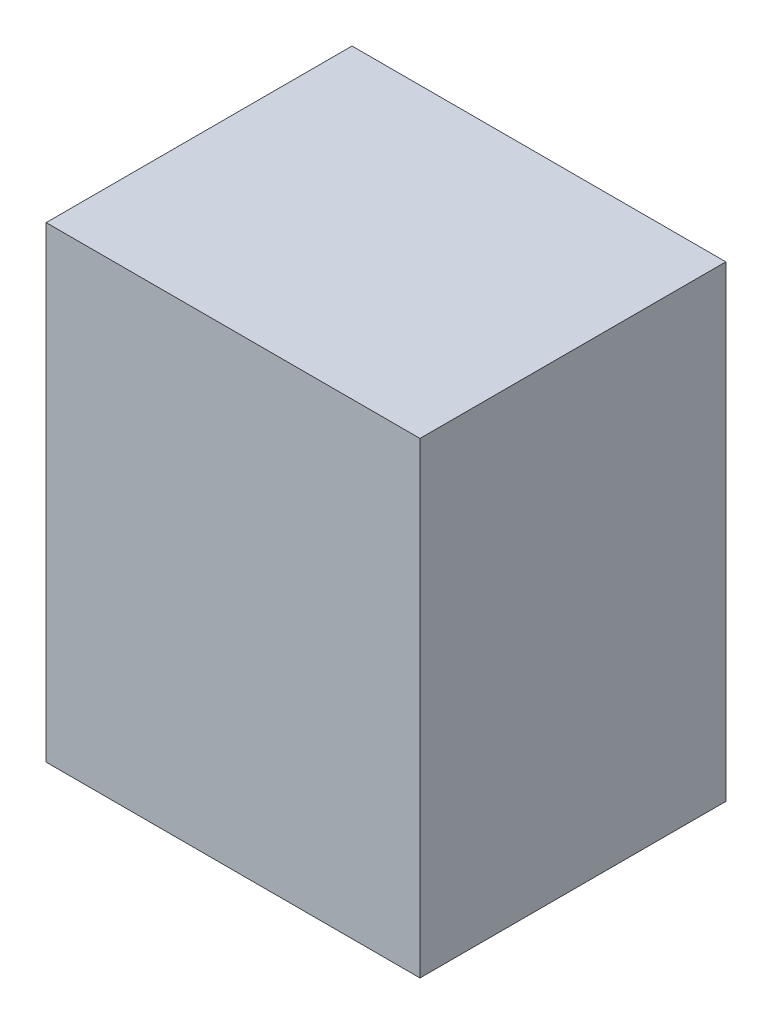
ISO-10303-21;
HEADER;
FILE_DESCRIPTION(('STEP AP214'),'2;1');
FILE_NAME('part.step','',(''),(''),'','','');
FILE_SCHEMA(('AUTOMOTIVE_DESIGN { 1 0 10303 214 1 1 1 1 }'));
ENDSEC;
DATA;
#1=APPLICATION_CONTEXT('core data for automotive mechanical design processes');
#2=APPLICATION_PROTOCOL_DEFINITION('international standard','automotive_design',2000,#1);
#3=PRODUCT_CONTEXT('',#1,'mechanical');
#4=PRODUCT('Part','Part','',(#3));
#5=PRODUCT_RELATED_PRODUCT_CATEGORY('part','',(#4));
#6=PRODUCT_DEFINITION_FORMATION('','',#4);
#7=PRODUCT_DEFINITION_CONTEXT('part definition',#1,'design');
#8=PRODUCT_DEFINITION('design','',#6,#7);
#9=PRODUCT_DEFINITION_SHAPE('','',#8);
#10=(LENGTH_UNIT() NAMED_UNIT(*) SI_UNIT(.MILLI.,.METRE.));
#11=(NAMED_UNIT(*) PLANE_ANGLE_UNIT() SI_UNIT($,.RADIAN.));
#12=(NAMED_UNIT(*) SI_UNIT($,.STERADIAN.) SOLID_ANGLE_UNIT());
#13=UNCERTAINTY_MEASURE_WITH_UNIT(LENGTH_MEASURE(1.E-05),#10,'distance_accuracy_value','');
#14=(GEOMETRIC_REPRESENTATION_CONTEXT(3) GLOBAL_UNCERTAINTY_ASSIGNED_CONTEXT((#13)) GLOBAL_UNIT_ASSIGNED_CONTEXT((#10,
#11,#12)) REPRESENTATION_CONTEXT('',''));
#15=CARTESIAN_POINT('',(0.,0.,0.));
#16=DIRECTION('',(0.,0.,1.));
#17=DIRECTION('',(1.,0.,0.));
#18=AXIS2_PLACEMENT_3D('',#15,#16,#17);
#19=CARTESIAN_POINT('',(-0.855,3.675,0.35));
#20=DIRECTION('',(0.,0.,-1.));
#21=DIRECTION('',(-1.,0.,0.));
#22=AXIS2_PLACEMENT_3D('',#19,#20,#21);
#23=PLANE('',#22);
#24=DIRECTION('',(0.,1.,0.));
#25=VECTOR('',#24,1.);
#26=CARTESIAN_POINT('',(-0.415,3.125,0.35));
#27=LINE('',#26,#25);
#28=CARTESIAN_POINT('',(-0.415,3.125,0.35));
#29=VERTEX_POINT('',#28);
#30=CARTESIAN_POINT('',(-0.415,3.675,0.35));
#31=VERTEX_POINT('',#30);
#32=EDGE_CURVE('E19',#29,#31,#27,.T.);
#33=ORIENTED_EDGE('',*,*,#32,.T.);
#34=DIRECTION('',(1.,0.,0.));
#35=VECTOR('',#34,1.);
#36=CARTESIAN_POINT('',(-0.855,3.675,0.35));
#37=LINE('',#36,#35);
#38=CARTESIAN_POINT('',(-0.855,3.675,0.35));
#39=VERTEX_POINT('',#38);
#40=EDGE_CURVE('E80',#31,#39,#37,.F.);
#41=ORIENTED_EDGE('',*,*,#40,.T.);
#42=DIRECTION('',(0.,1.,0.));
#43=VECTOR('',#42,1.);
#44=CARTESIAN_POINT('',(-0.855,3.125,0.35));
#45=LINE('',#44,#43);
#46=CARTESIAN_POINT('',(-0.855,3.125,0.35));
#47=VERTEX_POINT('',#46);
#48=EDGE_CURVE('E67',#39,#47,#45,.F.);
#49=ORIENTED_EDGE('',*,*,#48,.T.);
#50=DIRECTION('',(1.,0.,0.));
#51=VECTOR('',#50,1.);
#52=CARTESIAN_POINT('',(-0.855,3.125,0.35));
#53=LINE('',#52,#51);
#54=EDGE_CURVE('E54',#47,#29,#53,.T.);
#55=ORIENTED_EDGE('',*,*,#54,.T.);
#56=EDGE_LOOP('',(#33,#41,#49,#55));
#57=FACE_BOUND('',#56,.T.);
#58=ADVANCED_FACE('F16',(#57),#23,.F.);
#59=CARTESIAN_POINT('',(-0.415,3.125,-0.01));
#60=DIRECTION('',(-1.,0.,0.));
#61=DIRECTION('',(0.,0.,1.));
#62=AXIS2_PLACEMENT_3D('',#59,#60,#61);
#63=PLANE('',#62);
#64=DIRECTION('',(0.,0.,1.));
#65=VECTOR('',#64,1.);
#66=CARTESIAN_POINT('',(-0.415,3.125,-0.01));
#67=LINE('',#66,#65);
#68=CARTESIAN_POINT('',(-0.415,3.125,-0.01));
#69=VERTEX_POINT('',#68);
#70=EDGE_CURVE('E60',#29,#69,#67,.F.);
#71=ORIENTED_EDGE('',*,*,#70,.T.);
#72=DIRECTION('',(0.,1.,0.));
#73=VECTOR('',#72,1.);
#74=CARTESIAN_POINT('',(-0.415,3.675,-0.01));
#75=LINE('',#74,#73);
#76=CARTESIAN_POINT('',(-0.415,3.675,-0.01));
#77=VERTEX_POINT('',#76);
#78=EDGE_CURVE('E82',#77,#69,#75,.F.);
#79=ORIENTED_EDGE('',*,*,#78,.F.);
#80=DIRECTION('',(0.,0.,-1.));
#81=VECTOR('',#80,1.);
#82=CARTESIAN_POINT('',(-0.415,3.675,-0.01));
#83=LINE('',#82,#81);
#84=EDGE_CURVE('E63',#77,#31,#83,.F.);
#85=ORIENTED_EDGE('',*,*,#84,.T.);
#86=ORIENTED_EDGE('',*,*,#32,.F.);
#87=EDGE_LOOP('',(#71,#79,#85,#86));
#88=FACE_BOUND('',#87,.T.);
#89=ADVANCED_FACE('F59',(#88),#63,.F.);
#90=CARTESIAN_POINT('',(-0.855,3.125,-0.01));
#91=DIRECTION('',(0.,1.,0.));
#92=DIRECTION('',(0.,0.,1.));
#93=AXIS2_PLACEMENT_3D('',#90,#91,#92);
#94=PLANE('',#93);
#95=DIRECTION('',(0.,0.,-1.));
#96=VECTOR('',#95,1.);
#97=CARTESIAN_POINT('',(-0.855,3.125,-0.01));
#98=LINE('',#97,#96);
#99=CARTESIAN_POINT('',(-0.855,3.125,-0.01));
#100=VERTEX_POINT('',#99);
#101=EDGE_CURVE('E69',#47,#100,#98,.T.);
#102=ORIENTED_EDGE('',*,*,#101,.T.);
#103=DIRECTION('',(-1.,0.,0.));
#104=VECTOR('',#103,1.);
#105=CARTESIAN_POINT('',(-0.855,3.125,-0.01));
#106=LINE('',#105,#104);
#107=EDGE_CURVE('E73',#69,#100,#106,.T.);
#108=ORIENTED_EDGE('',*,*,#107,.F.);
#109=ORIENTED_EDGE('',*,*,#70,.F.);
#110=ORIENTED_EDGE('',*,*,#54,.F.);
#111=EDGE_LOOP('',(#102,#108,#109,#110));
#112=FACE_BOUND('',#111,.T.);
#113=ADVANCED_FACE('F71',(#112),#94,.F.);
#114=CARTESIAN_POINT('',(-0.855,3.125,-0.01));
#115=DIRECTION('',(1.,0.,0.));
#116=DIRECTION('',(0.,0.,-1.));
#117=AXIS2_PLACEMENT_3D('',#114,#115,#116);
#118=PLANE('',#117);
#119=DIRECTION('',(0.,0.,-1.));
#120=VECTOR('',#119,1.);
#121=CARTESIAN_POINT('',(-0.855,3.675,-0.01));
#122=LINE('',#121,#120);
#123=CARTESIAN_POINT('',(-0.855,3.675,-0.01));
#124=VERTEX_POINT('',#123);
#125=EDGE_CURVE('E34',#39,#124,#122,.T.);
#126=ORIENTED_EDGE('',*,*,#125,.T.);
#127=DIRECTION('',(0.,1.,0.));
#128=VECTOR('',#127,1.);
#129=CARTESIAN_POINT('',(-0.855,3.675,-0.01));
#130=LINE('',#129,#128);
#131=EDGE_CURVE('E25',#100,#124,#130,.T.);
#132=ORIENTED_EDGE('',*,*,#131,.F.);
#133=ORIENTED_EDGE('',*,*,#101,.F.);
#134=ORIENTED_EDGE('',*,*,#48,.F.);
#135=EDGE_LOOP('',(#126,#132,#133,#134));
#136=FACE_BOUND('',#135,.T.);
#137=ADVANCED_FACE('F88',(#136),#118,.F.);
#138=CARTESIAN_POINT('',(-0.855,3.675,-0.01));
#139=DIRECTION('',(0.,-1.,0.));
#140=DIRECTION('',(0.,0.,-1.));
#141=AXIS2_PLACEMENT_3D('',#138,#139,#140);
#142=PLANE('',#141);
#143=ORIENTED_EDGE('',*,*,#84,.F.);
#144=DIRECTION('',(-1.,0.,0.));
#145=VECTOR('',#144,1.);
#146=CARTESIAN_POINT('',(-0.855,3.675,-0.01));
#147=LINE('',#146,#145);
#148=EDGE_CURVE('E11',#124,#77,#147,.F.);
#149=ORIENTED_EDGE('',*,*,#148,.F.);
#150=ORIENTED_EDGE('',*,*,#125,.F.);
#151=ORIENTED_EDGE('',*,*,#40,.F.);
#152=EDGE_LOOP('',(#143,#149,#150,#151));
#153=FACE_BOUND('',#152,.T.);
#154=ADVANCED_FACE('F90',(#153),#142,.F.);
#155=CARTESIAN_POINT('',(-0.855,3.675,-0.01));
#156=DIRECTION('',(0.,0.,-1.));
#157=DIRECTION('',(-1.,0.,0.));
#158=AXIS2_PLACEMENT_3D('',#155,#156,#157);
#159=PLANE('',#158);
#160=ORIENTED_EDGE('',*,*,#131,.T.);
#161=ORIENTED_EDGE('',*,*,#148,.T.);
#162=ORIENTED_EDGE('',*,*,#78,.T.);
#163=ORIENTED_EDGE('',*,*,#107,.T.);
#164=EDGE_LOOP('',(#160,#161,#162,#163));
#165=FACE_BOUND('',#164,.T.);
#166=ADVANCED_FACE('F87',(#165),#159,.T.);
#167=CLOSED_SHELL('',(#58,#89,#113,#137,#154,#166));
#168=MANIFOLD_SOLID_BREP('B1',#167);
#169=ADVANCED_BREP_SHAPE_REPRESENTATION('',(#18,#168),#14);
#170=SHAPE_DEFINITION_REPRESENTATION(#9,#169);
ENDSEC;
END-ISO-10303-21;
